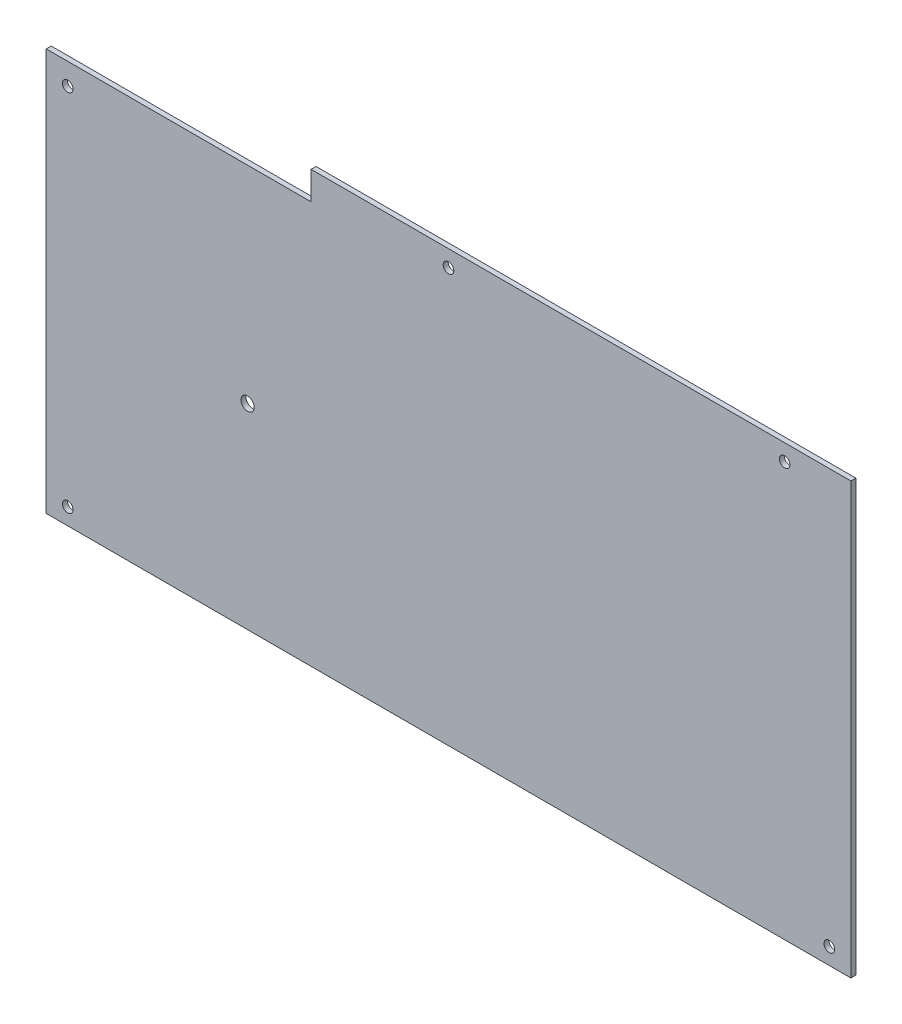
ISO-10303-21;
HEADER;
FILE_DESCRIPTION(('STEP AP214'),'2;1');
FILE_NAME('part.step','',(''),(''),'','','');
FILE_SCHEMA(('AUTOMOTIVE_DESIGN { 1 0 10303 214 1 1 1 1 }'));
ENDSEC;
DATA;
#1=APPLICATION_CONTEXT('core data for automotive mechanical design processes');
#2=APPLICATION_PROTOCOL_DEFINITION('international standard','automotive_design',2000,#1);
#3=PRODUCT_CONTEXT('',#1,'mechanical');
#4=PRODUCT('Part','Part','',(#3));
#5=PRODUCT_RELATED_PRODUCT_CATEGORY('part','',(#4));
#6=PRODUCT_DEFINITION_FORMATION('','',#4);
#7=PRODUCT_DEFINITION_CONTEXT('part definition',#1,'design');
#8=PRODUCT_DEFINITION('design','',#6,#7);
#9=PRODUCT_DEFINITION_SHAPE('','',#8);
#10=(LENGTH_UNIT() NAMED_UNIT(*) SI_UNIT(.MILLI.,.METRE.));
#11=(NAMED_UNIT(*) PLANE_ANGLE_UNIT() SI_UNIT($,.RADIAN.));
#12=(NAMED_UNIT(*) SI_UNIT($,.STERADIAN.) SOLID_ANGLE_UNIT());
#13=UNCERTAINTY_MEASURE_WITH_UNIT(LENGTH_MEASURE(1.E-05),#10,'distance_accuracy_value','');
#14=(GEOMETRIC_REPRESENTATION_CONTEXT(3) GLOBAL_UNCERTAINTY_ASSIGNED_CONTEXT((#13)) GLOBAL_UNIT_ASSIGNED_CONTEXT((#10,
#11,#12)) REPRESENTATION_CONTEXT('',''));
#15=CARTESIAN_POINT('',(0.,0.,0.));
#16=DIRECTION('',(0.,0.,1.));
#17=DIRECTION('',(1.,0.,0.));
#18=AXIS2_PLACEMENT_3D('',#15,#16,#17);
#19=CARTESIAN_POINT('',(0.,0.,1.5));
#20=DIRECTION('',(0.,0.,1.));
#21=DIRECTION('',(1.,0.,0.));
#22=AXIS2_PLACEMENT_3D('',#19,#20,#21);
#23=PLANE('',#22);
#24=CARTESIAN_POINT('',(-18.5,5.,1.5));
#25=DIRECTION('',(0.,0.,1.));
#26=DIRECTION('',(1.,0.,0.));
#27=AXIS2_PLACEMENT_3D('',#24,#25,#26);
#28=CIRCLE('',#27,1.6);
#29=CARTESIAN_POINT('',(-16.9,5.,1.5));
#30=VERTEX_POINT('',#29);
#31=EDGE_CURVE('E190',#30,#30,#28,.T.);
#32=ORIENTED_EDGE('',*,*,#31,.F.);
#33=EDGE_LOOP('',(#32));
#34=FACE_BOUND('',#33,.T.);
#35=CARTESIAN_POINT('',(-120.,5.,1.5));
#36=DIRECTION('',(0.,0.,1.));
#37=DIRECTION('',(1.,0.,0.));
#38=AXIS2_PLACEMENT_3D('',#35,#36,#37);
#39=CIRCLE('',#38,1.60000000000001);
#40=CARTESIAN_POINT('',(-118.4,5.,1.5));
#41=VERTEX_POINT('',#40);
#42=EDGE_CURVE('E192',#41,#41,#39,.T.);
#43=ORIENTED_EDGE('',*,*,#42,.F.);
#44=EDGE_LOOP('',(#43));
#45=FACE_BOUND('',#44,.T.);
#46=CARTESIAN_POINT('',(-5.,-115.,1.5));
#47=DIRECTION('',(0.,0.,1.));
#48=DIRECTION('',(1.,0.,0.));
#49=AXIS2_PLACEMENT_3D('',#46,#47,#48);
#50=CIRCLE('',#49,1.6);
#51=CARTESIAN_POINT('',(-3.4,-115.,1.5));
#52=VERTEX_POINT('',#51);
#53=EDGE_CURVE('E198',#52,#52,#50,.T.);
#54=ORIENTED_EDGE('',*,*,#53,.F.);
#55=EDGE_LOOP('',(#54));
#56=FACE_BOUND('',#55,.T.);
#57=CARTESIAN_POINT('',(-235.,-115.,1.5));
#58=DIRECTION('',(0.,0.,1.));
#59=DIRECTION('',(1.,0.,0.));
#60=AXIS2_PLACEMENT_3D('',#57,#58,#59);
#61=CIRCLE('',#60,1.59999999999999);
#62=CARTESIAN_POINT('',(-233.4,-115.,1.5));
#63=VERTEX_POINT('',#62);
#64=EDGE_CURVE('E204',#63,#63,#61,.T.);
#65=ORIENTED_EDGE('',*,*,#64,.F.);
#66=EDGE_LOOP('',(#65));
#67=FACE_BOUND('',#66,.T.);
#68=CARTESIAN_POINT('',(-234.999999999998,-5.00000000000015,1.5));
#69=DIRECTION('',(0.,0.,1.));
#70=DIRECTION('',(1.,0.,0.));
#71=AXIS2_PLACEMENT_3D('',#68,#69,#70);
#72=CIRCLE('',#71,1.59999999999999);
#73=CARTESIAN_POINT('',(-233.399999999998,-5.00000000000015,1.5));
#74=VERTEX_POINT('',#73);
#75=EDGE_CURVE('E210',#74,#74,#72,.T.);
#76=ORIENTED_EDGE('',*,*,#75,.F.);
#77=EDGE_LOOP('',(#76));
#78=FACE_BOUND('',#77,.T.);
#79=DIRECTION('',(0.,-1.,0.));
#80=VECTOR('',#79,1.);
#81=CARTESIAN_POINT('',(-241.5,1.49999999999999,1.5));
#82=LINE('',#81,#80);
#83=CARTESIAN_POINT('',(-241.5,1.49999999999999,1.5));
#84=VERTEX_POINT('',#83);
#85=CARTESIAN_POINT('',(-241.5,-120.,1.5));
#86=VERTEX_POINT('',#85);
#87=EDGE_CURVE('E128',#84,#86,#82,.T.);
#88=ORIENTED_EDGE('',*,*,#87,.T.);
#89=DIRECTION('',(1.,0.,0.));
#90=VECTOR('',#89,1.);
#91=CARTESIAN_POINT('',(-241.5,-120.,1.5));
#92=LINE('',#91,#90);
#93=CARTESIAN_POINT('',(1.50000000000002,-120.,1.5));
#94=VERTEX_POINT('',#93);
#95=EDGE_CURVE('E86',#86,#94,#92,.T.);
#96=ORIENTED_EDGE('',*,*,#95,.T.);
#97=DIRECTION('',(0.,1.,0.));
#98=VECTOR('',#97,1.);
#99=CARTESIAN_POINT('',(1.50000000000002,-120.,1.5));
#100=LINE('',#99,#98);
#101=CARTESIAN_POINT('',(1.50000000000002,10.,1.5));
#102=VERTEX_POINT('',#101);
#103=EDGE_CURVE('E99',#94,#102,#100,.T.);
#104=ORIENTED_EDGE('',*,*,#103,.T.);
#105=DIRECTION('',(-1.,0.,0.));
#106=VECTOR('',#105,1.);
#107=CARTESIAN_POINT('',(1.50000000000002,10.,1.5));
#108=LINE('',#107,#106);
#109=CARTESIAN_POINT('',(-161.500000000001,10.,1.5));
#110=VERTEX_POINT('',#109);
#111=EDGE_CURVE('E93',#102,#110,#108,.T.);
#112=ORIENTED_EDGE('',*,*,#111,.T.);
#113=DIRECTION('',(0.,-1.,0.));
#114=VECTOR('',#113,1.);
#115=CARTESIAN_POINT('',(-161.500000000001,10.,1.5));
#116=LINE('',#115,#114);
#117=CARTESIAN_POINT('',(-161.500000000001,1.49999999999999,1.5));
#118=VERTEX_POINT('',#117);
#119=EDGE_CURVE('E97',#110,#118,#116,.T.);
#120=ORIENTED_EDGE('',*,*,#119,.T.);
#121=DIRECTION('',(-1.,0.,0.));
#122=VECTOR('',#121,1.);
#123=CARTESIAN_POINT('',(-161.500000000001,1.49999999999999,1.5));
#124=LINE('',#123,#122);
#125=EDGE_CURVE('E49',#118,#84,#124,.T.);
#126=ORIENTED_EDGE('',*,*,#125,.T.);
#127=EDGE_LOOP('',(#88,#96,#104,#112,#120,#126));
#128=FACE_BOUND('',#127,.T.);
#129=CARTESIAN_POINT('',(-180.669950036748,-60.8705173524925,1.5));
#130=DIRECTION('',(0.,0.,1.));
#131=DIRECTION('',(1.,0.,0.));
#132=AXIS2_PLACEMENT_3D('',#129,#130,#131);
#133=CIRCLE('',#132,2.);
#134=CARTESIAN_POINT('',(-178.669950036748,-60.8705173524925,1.5));
#135=VERTEX_POINT('',#134);
#136=EDGE_CURVE('E121',#135,#135,#133,.T.);
#137=ORIENTED_EDGE('',*,*,#136,.F.);
#138=EDGE_LOOP('',(#137));
#139=FACE_BOUND('',#138,.T.);
#140=ADVANCED_FACE('F32',(#34,#45,#56,#67,#78,#128,#139),#23,.T.);
#141=CARTESIAN_POINT('',(0.,0.,0.));
#142=DIRECTION('',(0.,0.,1.));
#143=DIRECTION('',(1.,0.,0.));
#144=AXIS2_PLACEMENT_3D('',#141,#142,#143);
#145=PLANE('',#144);
#146=CARTESIAN_POINT('',(-18.5,5.,0.));
#147=DIRECTION('',(0.,0.,1.));
#148=DIRECTION('',(1.,0.,0.));
#149=AXIS2_PLACEMENT_3D('',#146,#147,#148);
#150=CIRCLE('',#149,1.6);
#151=CARTESIAN_POINT('',(-16.9,5.,0.));
#152=VERTEX_POINT('',#151);
#153=EDGE_CURVE('E188',#152,#152,#150,.T.);
#154=ORIENTED_EDGE('',*,*,#153,.T.);
#155=EDGE_LOOP('',(#154));
#156=FACE_BOUND('',#155,.T.);
#157=CARTESIAN_POINT('',(-120.,5.,0.));
#158=DIRECTION('',(0.,0.,1.));
#159=DIRECTION('',(1.,0.,0.));
#160=AXIS2_PLACEMENT_3D('',#157,#158,#159);
#161=CIRCLE('',#160,1.60000000000001);
#162=CARTESIAN_POINT('',(-118.4,5.,0.));
#163=VERTEX_POINT('',#162);
#164=EDGE_CURVE('E195',#163,#163,#161,.T.);
#165=ORIENTED_EDGE('',*,*,#164,.T.);
#166=EDGE_LOOP('',(#165));
#167=FACE_BOUND('',#166,.T.);
#168=CARTESIAN_POINT('',(-5.,-115.,0.));
#169=DIRECTION('',(0.,0.,1.));
#170=DIRECTION('',(1.,0.,0.));
#171=AXIS2_PLACEMENT_3D('',#168,#169,#170);
#172=CIRCLE('',#171,1.6);
#173=CARTESIAN_POINT('',(-3.4,-115.,0.));
#174=VERTEX_POINT('',#173);
#175=EDGE_CURVE('E201',#174,#174,#172,.T.);
#176=ORIENTED_EDGE('',*,*,#175,.T.);
#177=EDGE_LOOP('',(#176));
#178=FACE_BOUND('',#177,.T.);
#179=CARTESIAN_POINT('',(-235.,-115.,0.));
#180=DIRECTION('',(0.,0.,1.));
#181=DIRECTION('',(1.,0.,0.));
#182=AXIS2_PLACEMENT_3D('',#179,#180,#181);
#183=CIRCLE('',#182,1.59999999999999);
#184=CARTESIAN_POINT('',(-233.4,-115.,0.));
#185=VERTEX_POINT('',#184);
#186=EDGE_CURVE('E207',#185,#185,#183,.T.);
#187=ORIENTED_EDGE('',*,*,#186,.T.);
#188=EDGE_LOOP('',(#187));
#189=FACE_BOUND('',#188,.T.);
#190=CARTESIAN_POINT('',(-234.999999999998,-5.00000000000015,0.));
#191=DIRECTION('',(0.,0.,1.));
#192=DIRECTION('',(1.,0.,0.));
#193=AXIS2_PLACEMENT_3D('',#190,#191,#192);
#194=CIRCLE('',#193,1.59999999999999);
#195=CARTESIAN_POINT('',(-233.399999999998,-5.00000000000015,0.));
#196=VERTEX_POINT('',#195);
#197=EDGE_CURVE('E213',#196,#196,#194,.T.);
#198=ORIENTED_EDGE('',*,*,#197,.T.);
#199=EDGE_LOOP('',(#198));
#200=FACE_BOUND('',#199,.T.);
#201=DIRECTION('',(0.,-1.,0.));
#202=VECTOR('',#201,1.);
#203=CARTESIAN_POINT('',(-241.5,1.49999999999999,0.));
#204=LINE('',#203,#202);
#205=CARTESIAN_POINT('',(-241.5,1.49999999999999,0.));
#206=VERTEX_POINT('',#205);
#207=CARTESIAN_POINT('',(-241.5,-120.,0.));
#208=VERTEX_POINT('',#207);
#209=EDGE_CURVE('E117',#206,#208,#204,.T.);
#210=ORIENTED_EDGE('',*,*,#209,.F.);
#211=DIRECTION('',(-1.,0.,0.));
#212=VECTOR('',#211,1.);
#213=CARTESIAN_POINT('',(-161.500000000001,1.49999999999999,0.));
#214=LINE('',#213,#212);
#215=CARTESIAN_POINT('',(-161.500000000001,1.49999999999999,0.));
#216=VERTEX_POINT('',#215);
#217=EDGE_CURVE('E78',#216,#206,#214,.T.);
#218=ORIENTED_EDGE('',*,*,#217,.F.);
#219=DIRECTION('',(0.,-1.,0.));
#220=VECTOR('',#219,1.);
#221=CARTESIAN_POINT('',(-161.500000000001,10.,0.));
#222=LINE('',#221,#220);
#223=CARTESIAN_POINT('',(-161.500000000001,10.,0.));
#224=VERTEX_POINT('',#223);
#225=EDGE_CURVE('E72',#224,#216,#222,.T.);
#226=ORIENTED_EDGE('',*,*,#225,.F.);
#227=DIRECTION('',(-1.,0.,0.));
#228=VECTOR('',#227,1.);
#229=CARTESIAN_POINT('',(1.50000000000002,10.,0.));
#230=LINE('',#229,#228);
#231=CARTESIAN_POINT('',(1.50000000000002,10.,0.));
#232=VERTEX_POINT('',#231);
#233=EDGE_CURVE('E107',#232,#224,#230,.T.);
#234=ORIENTED_EDGE('',*,*,#233,.F.);
#235=DIRECTION('',(0.,1.,0.));
#236=VECTOR('',#235,1.);
#237=CARTESIAN_POINT('',(1.50000000000002,-120.,0.));
#238=LINE('',#237,#236);
#239=CARTESIAN_POINT('',(1.50000000000002,-120.,0.));
#240=VERTEX_POINT('',#239);
#241=EDGE_CURVE('E123',#240,#232,#238,.T.);
#242=ORIENTED_EDGE('',*,*,#241,.F.);
#243=DIRECTION('',(1.,0.,0.));
#244=VECTOR('',#243,1.);
#245=CARTESIAN_POINT('',(-241.5,-120.,0.));
#246=LINE('',#245,#244);
#247=EDGE_CURVE('E120',#208,#240,#246,.T.);
#248=ORIENTED_EDGE('',*,*,#247,.F.);
#249=EDGE_LOOP('',(#210,#218,#226,#234,#242,#248));
#250=FACE_BOUND('',#249,.T.);
#251=CARTESIAN_POINT('',(-180.669950036748,-60.8705173524925,0.));
#252=DIRECTION('',(0.,0.,1.));
#253=DIRECTION('',(1.,0.,0.));
#254=AXIS2_PLACEMENT_3D('',#251,#252,#253);
#255=CIRCLE('',#254,2.);
#256=CARTESIAN_POINT('',(-178.669950036748,-60.8705173524925,0.));
#257=VERTEX_POINT('',#256);
#258=EDGE_CURVE('E216',#257,#257,#255,.T.);
#259=ORIENTED_EDGE('',*,*,#258,.T.);
#260=EDGE_LOOP('',(#259));
#261=FACE_BOUND('',#260,.T.);
#262=ADVANCED_FACE('F137',(#156,#167,#178,#189,#200,#250,#261),#145,.F.);
#263=CARTESIAN_POINT('',(-241.5,1.49999999999999,1.5));
#264=DIRECTION('',(1.,0.,0.));
#265=DIRECTION('',(0.,1.,0.));
#266=AXIS2_PLACEMENT_3D('',#263,#264,#265);
#267=PLANE('',#266);
#268=ORIENTED_EDGE('',*,*,#209,.T.);
#269=DIRECTION('',(0.,0.,-1.));
#270=VECTOR('',#269,1.);
#271=CARTESIAN_POINT('',(-241.5,-120.,1.5));
#272=LINE('',#271,#270);
#273=EDGE_CURVE('E11',#86,#208,#272,.T.);
#274=ORIENTED_EDGE('',*,*,#273,.F.);
#275=ORIENTED_EDGE('',*,*,#87,.F.);
#276=DIRECTION('',(0.,0.,-1.));
#277=VECTOR('',#276,1.);
#278=CARTESIAN_POINT('',(-241.5,1.49999999999999,1.5));
#279=LINE('',#278,#277);
#280=EDGE_CURVE('E113',#84,#206,#279,.T.);
#281=ORIENTED_EDGE('',*,*,#280,.T.);
#282=EDGE_LOOP('',(#268,#274,#275,#281));
#283=FACE_BOUND('',#282,.T.);
#284=ADVANCED_FACE('F34',(#283),#267,.F.);
#285=CARTESIAN_POINT('',(-241.5,-120.,1.5));
#286=DIRECTION('',(0.,1.,0.));
#287=DIRECTION('',(0.,0.,1.));
#288=AXIS2_PLACEMENT_3D('',#285,#286,#287);
#289=PLANE('',#288);
#290=ORIENTED_EDGE('',*,*,#247,.T.);
#291=DIRECTION('',(0.,0.,-1.));
#292=VECTOR('',#291,1.);
#293=CARTESIAN_POINT('',(1.50000000000002,-120.,1.5));
#294=LINE('',#293,#292);
#295=EDGE_CURVE('E41',#94,#240,#294,.T.);
#296=ORIENTED_EDGE('',*,*,#295,.F.);
#297=ORIENTED_EDGE('',*,*,#95,.F.);
#298=ORIENTED_EDGE('',*,*,#273,.T.);
#299=EDGE_LOOP('',(#290,#296,#297,#298));
#300=FACE_BOUND('',#299,.T.);
#301=ADVANCED_FACE('F288',(#300),#289,.F.);
#302=CARTESIAN_POINT('',(1.50000000000002,-120.,1.5));
#303=DIRECTION('',(-1.,0.,0.));
#304=DIRECTION('',(0.,0.,1.));
#305=AXIS2_PLACEMENT_3D('',#302,#303,#304);
#306=PLANE('',#305);
#307=ORIENTED_EDGE('',*,*,#241,.T.);
#308=DIRECTION('',(0.,0.,-1.));
#309=VECTOR('',#308,1.);
#310=CARTESIAN_POINT('',(1.50000000000002,10.,1.5));
#311=LINE('',#310,#309);
#312=EDGE_CURVE('E108',#102,#232,#311,.T.);
#313=ORIENTED_EDGE('',*,*,#312,.F.);
#314=ORIENTED_EDGE('',*,*,#103,.F.);
#315=ORIENTED_EDGE('',*,*,#295,.T.);
#316=EDGE_LOOP('',(#307,#313,#314,#315));
#317=FACE_BOUND('',#316,.T.);
#318=ADVANCED_FACE('F134',(#317),#306,.F.);
#319=CARTESIAN_POINT('',(1.50000000000002,10.,1.5));
#320=DIRECTION('',(0.,-1.,0.));
#321=DIRECTION('',(1.,0.,0.));
#322=AXIS2_PLACEMENT_3D('',#319,#320,#321);
#323=PLANE('',#322);
#324=ORIENTED_EDGE('',*,*,#233,.T.);
#325=DIRECTION('',(0.,0.,-1.));
#326=VECTOR('',#325,1.);
#327=CARTESIAN_POINT('',(-161.500000000001,10.,1.5));
#328=LINE('',#327,#326);
#329=EDGE_CURVE('E104',#110,#224,#328,.T.);
#330=ORIENTED_EDGE('',*,*,#329,.F.);
#331=ORIENTED_EDGE('',*,*,#111,.F.);
#332=ORIENTED_EDGE('',*,*,#312,.T.);
#333=EDGE_LOOP('',(#324,#330,#331,#332));
#334=FACE_BOUND('',#333,.T.);
#335=ADVANCED_FACE('F105',(#334),#323,.F.);
#336=CARTESIAN_POINT('',(-161.500000000001,10.,1.5));
#337=DIRECTION('',(1.,0.,0.));
#338=DIRECTION('',(0.,0.,-1.));
#339=AXIS2_PLACEMENT_3D('',#336,#337,#338);
#340=PLANE('',#339);
#341=ORIENTED_EDGE('',*,*,#225,.T.);
#342=DIRECTION('',(0.,0.,-1.));
#343=VECTOR('',#342,1.);
#344=CARTESIAN_POINT('',(-161.500000000001,1.49999999999999,1.5));
#345=LINE('',#344,#343);
#346=EDGE_CURVE('E109',#118,#216,#345,.T.);
#347=ORIENTED_EDGE('',*,*,#346,.F.);
#348=ORIENTED_EDGE('',*,*,#119,.F.);
#349=ORIENTED_EDGE('',*,*,#329,.T.);
#350=EDGE_LOOP('',(#341,#347,#348,#349));
#351=FACE_BOUND('',#350,.T.);
#352=ADVANCED_FACE('F111',(#351),#340,.F.);
#353=CARTESIAN_POINT('',(-161.500000000001,1.49999999999999,1.5));
#354=DIRECTION('',(0.,-1.,0.));
#355=DIRECTION('',(1.,0.,0.));
#356=AXIS2_PLACEMENT_3D('',#353,#354,#355);
#357=PLANE('',#356);
#358=ORIENTED_EDGE('',*,*,#217,.T.);
#359=ORIENTED_EDGE('',*,*,#280,.F.);
#360=ORIENTED_EDGE('',*,*,#125,.F.);
#361=ORIENTED_EDGE('',*,*,#346,.T.);
#362=EDGE_LOOP('',(#358,#359,#360,#361));
#363=FACE_BOUND('',#362,.T.);
#364=ADVANCED_FACE('F142',(#363),#357,.F.);
#365=CARTESIAN_POINT('',(-180.669950036748,-60.8705173524925,1.5));
#366=DIRECTION('',(0.,0.,-1.));
#367=DIRECTION('',(-1.,0.,0.));
#368=AXIS2_PLACEMENT_3D('',#365,#366,#367);
#369=CYLINDRICAL_SURFACE('',#368,2.);
#370=ORIENTED_EDGE('',*,*,#136,.T.);
#371=EDGE_LOOP('',(#370));
#372=FACE_BOUND('',#371,.T.);
#373=ORIENTED_EDGE('',*,*,#258,.F.);
#374=EDGE_LOOP('',(#373));
#375=FACE_BOUND('',#374,.T.);
#376=ADVANCED_FACE('F144',(#372,#375),#369,.F.);
#377=CARTESIAN_POINT('',(-234.999999999998,-5.00000000000015,0.));
#378=DIRECTION('',(0.,0.,1.));
#379=DIRECTION('',(1.,0.,0.));
#380=AXIS2_PLACEMENT_3D('',#377,#378,#379);
#381=CYLINDRICAL_SURFACE('',#380,1.59999999999999);
#382=ORIENTED_EDGE('',*,*,#197,.F.);
#383=EDGE_LOOP('',(#382));
#384=FACE_BOUND('',#383,.T.);
#385=ORIENTED_EDGE('',*,*,#75,.T.);
#386=EDGE_LOOP('',(#385));
#387=FACE_BOUND('',#386,.T.);
#388=ADVANCED_FACE('F150',(#384,#387),#381,.F.);
#389=CARTESIAN_POINT('',(-235.,-115.,0.));
#390=DIRECTION('',(0.,0.,1.));
#391=DIRECTION('',(1.,0.,0.));
#392=AXIS2_PLACEMENT_3D('',#389,#390,#391);
#393=CYLINDRICAL_SURFACE('',#392,1.59999999999999);
#394=ORIENTED_EDGE('',*,*,#186,.F.);
#395=EDGE_LOOP('',(#394));
#396=FACE_BOUND('',#395,.T.);
#397=ORIENTED_EDGE('',*,*,#64,.T.);
#398=EDGE_LOOP('',(#397));
#399=FACE_BOUND('',#398,.T.);
#400=ADVANCED_FACE('F167',(#396,#399),#393,.F.);
#401=CARTESIAN_POINT('',(-5.,-115.,0.));
#402=DIRECTION('',(0.,0.,1.));
#403=DIRECTION('',(1.,0.,0.));
#404=AXIS2_PLACEMENT_3D('',#401,#402,#403);
#405=CYLINDRICAL_SURFACE('',#404,1.6);
#406=ORIENTED_EDGE('',*,*,#175,.F.);
#407=EDGE_LOOP('',(#406));
#408=FACE_BOUND('',#407,.T.);
#409=ORIENTED_EDGE('',*,*,#53,.T.);
#410=EDGE_LOOP('',(#409));
#411=FACE_BOUND('',#410,.T.);
#412=ADVANCED_FACE('F171',(#408,#411),#405,.F.);
#413=CARTESIAN_POINT('',(-120.,5.,0.));
#414=DIRECTION('',(0.,0.,1.));
#415=DIRECTION('',(1.,0.,0.));
#416=AXIS2_PLACEMENT_3D('',#413,#414,#415);
#417=CYLINDRICAL_SURFACE('',#416,1.60000000000001);
#418=ORIENTED_EDGE('',*,*,#164,.F.);
#419=EDGE_LOOP('',(#418));
#420=FACE_BOUND('',#419,.T.);
#421=ORIENTED_EDGE('',*,*,#42,.T.);
#422=EDGE_LOOP('',(#421));
#423=FACE_BOUND('',#422,.T.);
#424=ADVANCED_FACE('F175',(#420,#423),#417,.F.);
#425=CARTESIAN_POINT('',(-18.5,5.,0.));
#426=DIRECTION('',(0.,0.,1.));
#427=DIRECTION('',(1.,0.,0.));
#428=AXIS2_PLACEMENT_3D('',#425,#426,#427);
#429=CYLINDRICAL_SURFACE('',#428,1.6);
#430=ORIENTED_EDGE('',*,*,#153,.F.);
#431=EDGE_LOOP('',(#430));
#432=FACE_BOUND('',#431,.T.);
#433=ORIENTED_EDGE('',*,*,#31,.T.);
#434=EDGE_LOOP('',(#433));
#435=FACE_BOUND('',#434,.T.);
#436=ADVANCED_FACE('F179',(#432,#435),#429,.F.);
#437=CLOSED_SHELL('',(#140,#262,#284,#301,#318,#335,#352,#364,#376,#388,#400,#412,#424,#436));
#438=MANIFOLD_SOLID_BREP('B2',#437);
#439=ADVANCED_BREP_SHAPE_REPRESENTATION('',(#18,#438),#14);
#440=SHAPE_DEFINITION_REPRESENTATION(#9,#439);
ENDSEC;
END-ISO-10303-21;
